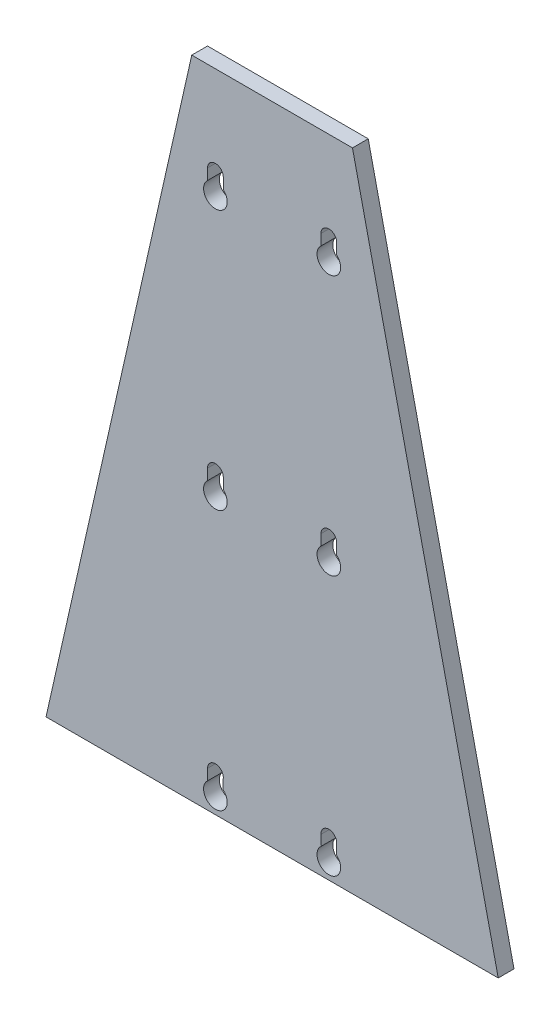
ISO-10303-21;
HEADER;
FILE_DESCRIPTION(('STEP AP214'),'2;1');
FILE_NAME('part.step','',(''),(''),'','','');
FILE_SCHEMA(('AUTOMOTIVE_DESIGN { 1 0 10303 214 1 1 1 1 }'));
ENDSEC;
DATA;
#1=APPLICATION_CONTEXT('core data for automotive mechanical design processes');
#2=APPLICATION_PROTOCOL_DEFINITION('international standard','automotive_design',2000,#1);
#3=PRODUCT_CONTEXT('',#1,'mechanical');
#4=PRODUCT('Part','Part','',(#3));
#5=PRODUCT_RELATED_PRODUCT_CATEGORY('part','',(#4));
#6=PRODUCT_DEFINITION_FORMATION('','',#4);
#7=PRODUCT_DEFINITION_CONTEXT('part definition',#1,'design');
#8=PRODUCT_DEFINITION('design','',#6,#7);
#9=PRODUCT_DEFINITION_SHAPE('','',#8);
#10=(LENGTH_UNIT() NAMED_UNIT(*) SI_UNIT(.MILLI.,.METRE.));
#11=(NAMED_UNIT(*) PLANE_ANGLE_UNIT() SI_UNIT($,.RADIAN.));
#12=(NAMED_UNIT(*) SI_UNIT($,.STERADIAN.) SOLID_ANGLE_UNIT());
#13=UNCERTAINTY_MEASURE_WITH_UNIT(LENGTH_MEASURE(1.E-05),#10,'distance_accuracy_value','');
#14=(GEOMETRIC_REPRESENTATION_CONTEXT(3) GLOBAL_UNCERTAINTY_ASSIGNED_CONTEXT((#13)) GLOBAL_UNIT_ASSIGNED_CONTEXT((#10,
#11,#12)) REPRESENTATION_CONTEXT('',''));
#15=CARTESIAN_POINT('',(0.,0.,0.));
#16=DIRECTION('',(0.,0.,1.));
#17=DIRECTION('',(1.,0.,0.));
#18=AXIS2_PLACEMENT_3D('',#15,#16,#17);
#19=CARTESIAN_POINT('',(31.,0.,10.));
#20=DIRECTION('',(1.,0.,0.));
#21=DIRECTION('',(0.,1.,0.));
#22=AXIS2_PLACEMENT_3D('',#19,#20,#21);
#23=PLANE('',#22);
#24=DIRECTION('',(0.,-1.,0.));
#25=VECTOR('',#24,1.);
#26=CARTESIAN_POINT('',(31.,0.,0.));
#27=LINE('',#26,#25);
#28=CARTESIAN_POINT('',(31.,-57.,0.));
#29=VERTEX_POINT('',#28);
#30=CARTESIAN_POINT('',(31.,-63.9098300562505,0.));
#31=VERTEX_POINT('',#30);
#32=EDGE_CURVE('E391',#29,#31,#27,.T.);
#33=ORIENTED_EDGE('',*,*,#32,.F.);
#34=DIRECTION('',(0.,0.,-1.));
#35=VECTOR('',#34,1.);
#36=CARTESIAN_POINT('',(31.,-57.,10.));
#37=LINE('',#36,#35);
#38=CARTESIAN_POINT('',(31.,-57.,10.));
#39=VERTEX_POINT('',#38);
#40=EDGE_CURVE('E11',#39,#29,#37,.T.);
#41=ORIENTED_EDGE('',*,*,#40,.F.);
#42=DIRECTION('',(0.,-1.,0.));
#43=VECTOR('',#42,1.);
#44=CARTESIAN_POINT('',(31.,0.,10.));
#45=LINE('',#44,#43);
#46=CARTESIAN_POINT('',(31.,-63.9098300562505,10.));
#47=VERTEX_POINT('',#46);
#48=EDGE_CURVE('E245',#39,#47,#45,.T.);
#49=ORIENTED_EDGE('',*,*,#48,.T.);
#50=DIRECTION('',(0.,0.,-1.));
#51=VECTOR('',#50,1.);
#52=CARTESIAN_POINT('',(31.,-63.9098300562505,10.));
#53=LINE('',#52,#51);
#54=EDGE_CURVE('E151',#47,#31,#53,.T.);
#55=ORIENTED_EDGE('',*,*,#54,.T.);
#56=EDGE_LOOP('',(#33,#41,#49,#55));
#57=FACE_BOUND('',#56,.T.);
#58=ADVANCED_FACE('F38',(#57),#23,.T.);
#59=CARTESIAN_POINT('',(36.,-57.,10.));
#60=DIRECTION('',(0.,0.,-1.));
#61=DIRECTION('',(-1.,0.,0.));
#62=AXIS2_PLACEMENT_3D('',#59,#60,#61);
#63=CYLINDRICAL_SURFACE('',#62,5.);
#64=CARTESIAN_POINT('',(36.,-57.,0.));
#65=DIRECTION('',(0.,0.,1.));
#66=DIRECTION('',(1.,0.,0.));
#67=AXIS2_PLACEMENT_3D('',#64,#65,#66);
#68=CIRCLE('',#67,5.);
#69=CARTESIAN_POINT('',(41.,-57.,0.));
#70=VERTEX_POINT('',#69);
#71=EDGE_CURVE('E250',#29,#70,#68,.F.);
#72=ORIENTED_EDGE('',*,*,#71,.T.);
#73=DIRECTION('',(0.,0.,-1.));
#74=VECTOR('',#73,1.);
#75=CARTESIAN_POINT('',(41.,-57.,10.));
#76=LINE('',#75,#74);
#77=CARTESIAN_POINT('',(41.,-57.,10.));
#78=VERTEX_POINT('',#77);
#79=EDGE_CURVE('E48',#78,#70,#76,.T.);
#80=ORIENTED_EDGE('',*,*,#79,.F.);
#81=CARTESIAN_POINT('',(36.,-57.,10.));
#82=DIRECTION('',(0.,0.,1.));
#83=DIRECTION('',(1.,0.,0.));
#84=AXIS2_PLACEMENT_3D('',#81,#82,#83);
#85=CIRCLE('',#84,5.);
#86=EDGE_CURVE('E241',#39,#78,#85,.F.);
#87=ORIENTED_EDGE('',*,*,#86,.F.);
#88=ORIENTED_EDGE('',*,*,#40,.T.);
#89=EDGE_LOOP('',(#72,#80,#87,#88));
#90=FACE_BOUND('',#89,.T.);
#91=ADVANCED_FACE('F248',(#90),#63,.F.);
#92=CARTESIAN_POINT('',(41.,0.,10.));
#93=DIRECTION('',(1.,0.,0.));
#94=DIRECTION('',(0.,0.,-1.));
#95=AXIS2_PLACEMENT_3D('',#92,#93,#94);
#96=PLANE('',#95);
#97=DIRECTION('',(0.,-1.,0.));
#98=VECTOR('',#97,1.);
#99=CARTESIAN_POINT('',(41.,0.,0.));
#100=LINE('',#99,#98);
#101=CARTESIAN_POINT('',(41.,-63.9098300562505,0.));
#102=VERTEX_POINT('',#101);
#103=EDGE_CURVE('E394',#70,#102,#100,.T.);
#104=ORIENTED_EDGE('',*,*,#103,.T.);
#105=DIRECTION('',(0.,0.,-1.));
#106=VECTOR('',#105,1.);
#107=CARTESIAN_POINT('',(41.,-63.9098300562505,10.));
#108=LINE('',#107,#106);
#109=CARTESIAN_POINT('',(41.,-63.9098300562505,10.));
#110=VERTEX_POINT('',#109);
#111=EDGE_CURVE('E240',#110,#102,#108,.T.);
#112=ORIENTED_EDGE('',*,*,#111,.F.);
#113=DIRECTION('',(0.,-1.,0.));
#114=VECTOR('',#113,1.);
#115=CARTESIAN_POINT('',(41.,0.,10.));
#116=LINE('',#115,#114);
#117=EDGE_CURVE('E234',#78,#110,#116,.T.);
#118=ORIENTED_EDGE('',*,*,#117,.F.);
#119=ORIENTED_EDGE('',*,*,#79,.T.);
#120=EDGE_LOOP('',(#104,#112,#118,#119));
#121=FACE_BOUND('',#120,.T.);
#122=ADVANCED_FACE('F237',(#121),#96,.F.);
#123=CARTESIAN_POINT('',(31.0000000000001,0.,10.));
#124=DIRECTION('',(1.,0.,0.));
#125=DIRECTION('',(0.,0.,-1.));
#126=AXIS2_PLACEMENT_3D('',#123,#124,#125);
#127=PLANE('',#126);
#128=DIRECTION('',(0.,-1.,0.));
#129=VECTOR('',#128,1.);
#130=CARTESIAN_POINT('',(31.0000000000001,0.,0.));
#131=LINE('',#130,#129);
#132=CARTESIAN_POINT('',(31.0000000000001,-222.,0.));
#133=VERTEX_POINT('',#132);
#134=CARTESIAN_POINT('',(31.0000000000001,-228.909830056251,0.));
#135=VERTEX_POINT('',#134);
#136=EDGE_CURVE('E379',#133,#135,#131,.T.);
#137=ORIENTED_EDGE('',*,*,#136,.F.);
#138=DIRECTION('',(0.,0.,-1.));
#139=VECTOR('',#138,1.);
#140=CARTESIAN_POINT('',(31.0000000000001,-222.,10.));
#141=LINE('',#140,#139);
#142=CARTESIAN_POINT('',(31.0000000000001,-222.,10.));
#143=VERTEX_POINT('',#142);
#144=EDGE_CURVE('E264',#143,#133,#141,.T.);
#145=ORIENTED_EDGE('',*,*,#144,.F.);
#146=DIRECTION('',(0.,-1.,0.));
#147=VECTOR('',#146,1.);
#148=CARTESIAN_POINT('',(31.0000000000001,0.,10.));
#149=LINE('',#148,#147);
#150=CARTESIAN_POINT('',(31.0000000000001,-228.909830056251,10.));
#151=VERTEX_POINT('',#150);
#152=EDGE_CURVE('E448',#143,#151,#149,.T.);
#153=ORIENTED_EDGE('',*,*,#152,.T.);
#154=DIRECTION('',(0.,0.,-1.));
#155=VECTOR('',#154,1.);
#156=CARTESIAN_POINT('',(31.0000000000001,-228.909830056251,10.));
#157=LINE('',#156,#155);
#158=EDGE_CURVE('E255',#151,#135,#157,.T.);
#159=ORIENTED_EDGE('',*,*,#158,.T.);
#160=EDGE_LOOP('',(#137,#145,#153,#159));
#161=FACE_BOUND('',#160,.T.);
#162=ADVANCED_FACE('F490',(#161),#127,.T.);
#163=CARTESIAN_POINT('',(36.,-222.,10.));
#164=DIRECTION('',(0.,0.,-1.));
#165=DIRECTION('',(-1.,0.,0.));
#166=AXIS2_PLACEMENT_3D('',#163,#164,#165);
#167=CYLINDRICAL_SURFACE('',#166,5.);
#168=CARTESIAN_POINT('',(36.,-222.,0.));
#169=DIRECTION('',(0.,0.,1.));
#170=DIRECTION('',(1.,0.,0.));
#171=AXIS2_PLACEMENT_3D('',#168,#169,#170);
#172=CIRCLE('',#171,5.);
#173=CARTESIAN_POINT('',(41.0000000000001,-222.,0.));
#174=VERTEX_POINT('',#173);
#175=EDGE_CURVE('E382',#133,#174,#172,.F.);
#176=ORIENTED_EDGE('',*,*,#175,.T.);
#177=DIRECTION('',(0.,0.,-1.));
#178=VECTOR('',#177,1.);
#179=CARTESIAN_POINT('',(41.0000000000001,-222.,10.));
#180=LINE('',#179,#178);
#181=CARTESIAN_POINT('',(41.0000000000001,-222.,10.));
#182=VERTEX_POINT('',#181);
#183=EDGE_CURVE('E261',#182,#174,#180,.T.);
#184=ORIENTED_EDGE('',*,*,#183,.F.);
#185=CARTESIAN_POINT('',(36.,-222.,10.));
#186=DIRECTION('',(0.,0.,1.));
#187=DIRECTION('',(1.,0.,0.));
#188=AXIS2_PLACEMENT_3D('',#185,#186,#187);
#189=CIRCLE('',#188,5.);
#190=EDGE_CURVE('E451',#143,#182,#189,.F.);
#191=ORIENTED_EDGE('',*,*,#190,.F.);
#192=ORIENTED_EDGE('',*,*,#144,.T.);
#193=EDGE_LOOP('',(#176,#184,#191,#192));
#194=FACE_BOUND('',#193,.T.);
#195=ADVANCED_FACE('F486',(#194),#167,.F.);
#196=CARTESIAN_POINT('',(41.0000000000001,0.,10.));
#197=DIRECTION('',(1.,0.,0.));
#198=DIRECTION('',(0.,0.,-1.));
#199=AXIS2_PLACEMENT_3D('',#196,#197,#198);
#200=PLANE('',#199);
#201=DIRECTION('',(0.,-1.,0.));
#202=VECTOR('',#201,1.);
#203=CARTESIAN_POINT('',(41.0000000000001,0.,0.));
#204=LINE('',#203,#202);
#205=CARTESIAN_POINT('',(41.0000000000001,-228.909830056251,0.));
#206=VERTEX_POINT('',#205);
#207=EDGE_CURVE('E385',#174,#206,#204,.T.);
#208=ORIENTED_EDGE('',*,*,#207,.T.);
#209=DIRECTION('',(0.,0.,-1.));
#210=VECTOR('',#209,1.);
#211=CARTESIAN_POINT('',(41.0000000000001,-228.909830056251,10.));
#212=LINE('',#211,#210);
#213=CARTESIAN_POINT('',(41.0000000000001,-228.909830056251,10.));
#214=VERTEX_POINT('',#213);
#215=EDGE_CURVE('E257',#214,#206,#212,.T.);
#216=ORIENTED_EDGE('',*,*,#215,.F.);
#217=DIRECTION('',(0.,-1.,0.));
#218=VECTOR('',#217,1.);
#219=CARTESIAN_POINT('',(41.0000000000001,0.,10.));
#220=LINE('',#219,#218);
#221=EDGE_CURVE('E454',#182,#214,#220,.T.);
#222=ORIENTED_EDGE('',*,*,#221,.F.);
#223=ORIENTED_EDGE('',*,*,#183,.T.);
#224=EDGE_LOOP('',(#208,#216,#222,#223));
#225=FACE_BOUND('',#224,.T.);
#226=ADVANCED_FACE('F482',(#225),#200,.F.);
#227=CARTESIAN_POINT('',(41.0000000000005,0.,10.));
#228=DIRECTION('',(1.,0.,0.));
#229=DIRECTION('',(0.,1.,0.));
#230=AXIS2_PLACEMENT_3D('',#227,#228,#229);
#231=PLANE('',#230);
#232=DIRECTION('',(0.,-1.,0.));
#233=VECTOR('',#232,1.);
#234=CARTESIAN_POINT('',(41.0000000000005,0.,0.));
#235=LINE('',#234,#233);
#236=CARTESIAN_POINT('',(41.0000000000001,-387.,0.));
#237=VERTEX_POINT('',#236);
#238=CARTESIAN_POINT('',(41.0000000000001,-393.909830056251,0.));
#239=VERTEX_POINT('',#238);
#240=EDGE_CURVE('E368',#237,#239,#235,.T.);
#241=ORIENTED_EDGE('',*,*,#240,.T.);
#242=DIRECTION('',(0.,0.,-1.));
#243=VECTOR('',#242,1.);
#244=CARTESIAN_POINT('',(41.0000000000001,-393.909830056251,10.));
#245=LINE('',#244,#243);
#246=CARTESIAN_POINT('',(41.0000000000001,-393.909830056251,10.));
#247=VERTEX_POINT('',#246);
#248=EDGE_CURVE('E258',#247,#239,#245,.T.);
#249=ORIENTED_EDGE('',*,*,#248,.F.);
#250=DIRECTION('',(0.,-1.,0.));
#251=VECTOR('',#250,1.);
#252=CARTESIAN_POINT('',(41.0000000000005,0.,10.));
#253=LINE('',#252,#251);
#254=CARTESIAN_POINT('',(41.0000000000001,-387.,10.));
#255=VERTEX_POINT('',#254);
#256=EDGE_CURVE('E438',#255,#247,#253,.T.);
#257=ORIENTED_EDGE('',*,*,#256,.F.);
#258=DIRECTION('',(0.,0.,-1.));
#259=VECTOR('',#258,1.);
#260=CARTESIAN_POINT('',(41.0000000000001,-387.,10.));
#261=LINE('',#260,#259);
#262=EDGE_CURVE('E266',#255,#237,#261,.T.);
#263=ORIENTED_EDGE('',*,*,#262,.T.);
#264=EDGE_LOOP('',(#241,#249,#257,#263));
#265=FACE_BOUND('',#264,.T.);
#266=ADVANCED_FACE('F485',(#265),#231,.F.);
#267=CARTESIAN_POINT('',(36.0000000000001,-399.5,10.));
#268=DIRECTION('',(0.,0.,-1.));
#269=DIRECTION('',(-1.,0.,0.));
#270=AXIS2_PLACEMENT_3D('',#267,#268,#269);
#271=CYLINDRICAL_SURFACE('',#270,7.50000000000002);
#272=CARTESIAN_POINT('',(36.0000000000001,-399.5,0.));
#273=DIRECTION('',(0.,0.,1.));
#274=DIRECTION('',(1.,0.,0.));
#275=AXIS2_PLACEMENT_3D('',#272,#273,#274);
#276=CIRCLE('',#275,7.50000000000002);
#277=CARTESIAN_POINT('',(31.1897541478711,-393.74573768046,0.));
#278=VERTEX_POINT('',#277);
#279=EDGE_CURVE('E371',#239,#278,#276,.F.);
#280=ORIENTED_EDGE('',*,*,#279,.T.);
#281=DIRECTION('',(0.,0.,-1.));
#282=VECTOR('',#281,1.);
#283=CARTESIAN_POINT('',(31.1897541478711,-393.74573768046,10.));
#284=LINE('',#283,#282);
#285=CARTESIAN_POINT('',(31.1897541478711,-393.74573768046,10.));
#286=VERTEX_POINT('',#285);
#287=EDGE_CURVE('E272',#286,#278,#284,.T.);
#288=ORIENTED_EDGE('',*,*,#287,.F.);
#289=CARTESIAN_POINT('',(36.0000000000001,-399.5,10.));
#290=DIRECTION('',(0.,0.,1.));
#291=DIRECTION('',(1.,0.,0.));
#292=AXIS2_PLACEMENT_3D('',#289,#290,#291);
#293=CIRCLE('',#292,7.50000000000002);
#294=EDGE_CURVE('E441',#247,#286,#293,.F.);
#295=ORIENTED_EDGE('',*,*,#294,.F.);
#296=ORIENTED_EDGE('',*,*,#248,.T.);
#297=EDGE_LOOP('',(#280,#288,#295,#296));
#298=FACE_BOUND('',#297,.T.);
#299=ADVANCED_FACE('F503',(#298),#271,.F.);
#300=CARTESIAN_POINT('',(20.0979852071029,0.565346035904268,10.));
#301=DIRECTION('',(0.999604600584097,0.0281183657261408,0.));
#302=DIRECTION('',(-0.0281183657261408,0.999604600584097,0.));
#303=AXIS2_PLACEMENT_3D('',#300,#301,#302);
#304=PLANE('',#303);
#305=DIRECTION('',(0.0281183657261408,-0.999604600584097,0.));
#306=VECTOR('',#305,1.);
#307=CARTESIAN_POINT('',(20.0979852071029,0.565346035904268,0.));
#308=LINE('',#307,#306);
#309=CARTESIAN_POINT('',(31.0079064249112,-387.281072477408,0.));
#310=VERTEX_POINT('',#309);
#311=EDGE_CURVE('E374',#310,#278,#308,.T.);
#312=ORIENTED_EDGE('',*,*,#311,.F.);
#313=DIRECTION('',(0.,0.,-1.));
#314=VECTOR('',#313,1.);
#315=CARTESIAN_POINT('',(31.0079064249112,-387.281072477408,10.));
#316=LINE('',#315,#314);
#317=CARTESIAN_POINT('',(31.0079064249112,-387.281072477408,10.));
#318=VERTEX_POINT('',#317);
#319=EDGE_CURVE('E269',#318,#310,#316,.T.);
#320=ORIENTED_EDGE('',*,*,#319,.F.);
#321=DIRECTION('',(0.0281183657261408,-0.999604600584097,0.));
#322=VECTOR('',#321,1.);
#323=CARTESIAN_POINT('',(20.0979852071029,0.565346035904268,10.));
#324=LINE('',#323,#322);
#325=EDGE_CURVE('E443',#318,#286,#324,.T.);
#326=ORIENTED_EDGE('',*,*,#325,.T.);
#327=ORIENTED_EDGE('',*,*,#287,.T.);
#328=EDGE_LOOP('',(#312,#320,#326,#327));
#329=FACE_BOUND('',#328,.T.);
#330=ADVANCED_FACE('F499',(#329),#304,.T.);
#331=CARTESIAN_POINT('',(-48.5298425614718,10.9488059437467,10.));
#332=DIRECTION('',(-0.97548220917709,0.220078303289953,0.));
#333=DIRECTION('',(-0.220078303289953,-0.97548220917709,0.));
#334=AXIS2_PLACEMENT_3D('',#331,#332,#333);
#335=PLANE('',#334);
#336=DIRECTION('',(0.220078303289953,0.97548220917709,0.));
#337=VECTOR('',#336,1.);
#338=CARTESIAN_POINT('',(-48.5298425614718,10.9488059437467,0.));
#339=LINE('',#338,#337);
#340=CARTESIAN_POINT('',(-143.5,-410.,0.));
#341=VERTEX_POINT('',#340);
#342=CARTESIAN_POINT('',(-51.,0.,0.));
#343=VERTEX_POINT('',#342);
#344=EDGE_CURVE('E356',#341,#343,#339,.T.);
#345=ORIENTED_EDGE('',*,*,#344,.F.);
#346=DIRECTION('',(0.,0.,-1.));
#347=VECTOR('',#346,1.);
#348=CARTESIAN_POINT('',(-143.5,-410.,10.));
#349=LINE('',#348,#347);
#350=CARTESIAN_POINT('',(-143.5,-410.,10.));
#351=VERTEX_POINT('',#350);
#352=EDGE_CURVE('E270',#351,#341,#349,.T.);
#353=ORIENTED_EDGE('',*,*,#352,.F.);
#354=DIRECTION('',(0.220078303289953,0.97548220917709,0.));
#355=VECTOR('',#354,1.);
#356=CARTESIAN_POINT('',(-48.5298425614718,10.9488059437467,10.));
#357=LINE('',#356,#355);
#358=CARTESIAN_POINT('',(-51.,0.,10.));
#359=VERTEX_POINT('',#358);
#360=EDGE_CURVE('E427',#351,#359,#357,.T.);
#361=ORIENTED_EDGE('',*,*,#360,.T.);
#362=DIRECTION('',(0.,0.,-1.));
#363=VECTOR('',#362,1.);
#364=CARTESIAN_POINT('',(-51.,0.,10.));
#365=LINE('',#364,#363);
#366=EDGE_CURVE('E276',#359,#343,#365,.T.);
#367=ORIENTED_EDGE('',*,*,#366,.T.);
#368=EDGE_LOOP('',(#345,#353,#361,#367));
#369=FACE_BOUND('',#368,.T.);
#370=ADVANCED_FACE('F502',(#369),#335,.T.);
#371=CARTESIAN_POINT('',(0.,-410.,10.));
#372=DIRECTION('',(0.,1.,0.));
#373=DIRECTION('',(-1.,0.,0.));
#374=AXIS2_PLACEMENT_3D('',#371,#372,#373);
#375=PLANE('',#374);
#376=DIRECTION('',(1.,0.,0.));
#377=VECTOR('',#376,1.);
#378=CARTESIAN_POINT('',(0.,-410.,0.));
#379=LINE('',#378,#377);
#380=CARTESIAN_POINT('',(143.5,-410.,0.));
#381=VERTEX_POINT('',#380);
#382=EDGE_CURVE('E359',#341,#381,#379,.T.);
#383=ORIENTED_EDGE('',*,*,#382,.T.);
#384=DIRECTION('',(0.,0.,-1.));
#385=VECTOR('',#384,1.);
#386=CARTESIAN_POINT('',(143.5,-410.,10.));
#387=LINE('',#386,#385);
#388=CARTESIAN_POINT('',(143.5,-410.,10.));
#389=VERTEX_POINT('',#388);
#390=EDGE_CURVE('E281',#389,#381,#387,.T.);
#391=ORIENTED_EDGE('',*,*,#390,.F.);
#392=DIRECTION('',(1.,0.,0.));
#393=VECTOR('',#392,1.);
#394=CARTESIAN_POINT('',(0.,-410.,10.));
#395=LINE('',#394,#393);
#396=EDGE_CURVE('E430',#351,#389,#395,.T.);
#397=ORIENTED_EDGE('',*,*,#396,.F.);
#398=ORIENTED_EDGE('',*,*,#352,.T.);
#399=EDGE_LOOP('',(#383,#391,#397,#398));
#400=FACE_BOUND('',#399,.T.);
#401=ADVANCED_FACE('F519',(#400),#375,.F.);
#402=CARTESIAN_POINT('',(48.5298425614718,10.9488059437467,10.));
#403=DIRECTION('',(-0.97548220917709,-0.220078303289953,0.));
#404=DIRECTION('',(0.220078303289953,-0.97548220917709,0.));
#405=AXIS2_PLACEMENT_3D('',#402,#403,#404);
#406=PLANE('',#405);
#407=DIRECTION('',(-0.220078303289953,0.97548220917709,0.));
#408=VECTOR('',#407,1.);
#409=CARTESIAN_POINT('',(48.5298425614718,10.9488059437467,0.));
#410=LINE('',#409,#408);
#411=CARTESIAN_POINT('',(51.,0.,0.));
#412=VERTEX_POINT('',#411);
#413=EDGE_CURVE('E362',#381,#412,#410,.T.);
#414=ORIENTED_EDGE('',*,*,#413,.T.);
#415=DIRECTION('',(0.,0.,-1.));
#416=VECTOR('',#415,1.);
#417=CARTESIAN_POINT('',(51.,0.,10.));
#418=LINE('',#417,#416);
#419=CARTESIAN_POINT('',(51.,0.,10.));
#420=VERTEX_POINT('',#419);
#421=EDGE_CURVE('E278',#420,#412,#418,.T.);
#422=ORIENTED_EDGE('',*,*,#421,.F.);
#423=DIRECTION('',(-0.220078303289953,0.97548220917709,0.));
#424=VECTOR('',#423,1.);
#425=CARTESIAN_POINT('',(48.5298425614718,10.9488059437467,10.));
#426=LINE('',#425,#424);
#427=EDGE_CURVE('E433',#389,#420,#426,.T.);
#428=ORIENTED_EDGE('',*,*,#427,.F.);
#429=ORIENTED_EDGE('',*,*,#390,.T.);
#430=EDGE_LOOP('',(#414,#422,#428,#429));
#431=FACE_BOUND('',#430,.T.);
#432=ADVANCED_FACE('F515',(#431),#406,.F.);
#433=CARTESIAN_POINT('',(-36.,-234.5,10.));
#434=DIRECTION('',(0.,0.,-1.));
#435=DIRECTION('',(-1.,0.,0.));
#436=AXIS2_PLACEMENT_3D('',#433,#434,#435);
#437=CYLINDRICAL_SURFACE('',#436,7.5);
#438=CARTESIAN_POINT('',(-36.,-234.5,0.));
#439=DIRECTION('',(0.,0.,1.));
#440=DIRECTION('',(1.,0.,0.));
#441=AXIS2_PLACEMENT_3D('',#438,#439,#440);
#442=CIRCLE('',#441,7.5);
#443=CARTESIAN_POINT('',(-41.,-228.909830056251,0.));
#444=VERTEX_POINT('',#443);
#445=CARTESIAN_POINT('',(-31.,-228.909830056251,0.));
#446=VERTEX_POINT('',#445);
#447=EDGE_CURVE('E344',#444,#446,#442,.T.);
#448=ORIENTED_EDGE('',*,*,#447,.F.);
#449=DIRECTION('',(0.,0.,-1.));
#450=VECTOR('',#449,1.);
#451=CARTESIAN_POINT('',(-41.,-228.909830056251,10.));
#452=LINE('',#451,#450);
#453=CARTESIAN_POINT('',(-41.,-228.909830056251,10.));
#454=VERTEX_POINT('',#453);
#455=EDGE_CURVE('E279',#454,#444,#452,.T.);
#456=ORIENTED_EDGE('',*,*,#455,.F.);
#457=CARTESIAN_POINT('',(-36.,-234.5,10.));
#458=DIRECTION('',(0.,0.,1.));
#459=DIRECTION('',(1.,0.,0.));
#460=AXIS2_PLACEMENT_3D('',#457,#458,#459);
#461=CIRCLE('',#460,7.5);
#462=CARTESIAN_POINT('',(-31.,-228.909830056251,10.));
#463=VERTEX_POINT('',#462);
#464=EDGE_CURVE('E416',#454,#463,#461,.T.);
#465=ORIENTED_EDGE('',*,*,#464,.T.);
#466=DIRECTION('',(0.,0.,-1.));
#467=VECTOR('',#466,1.);
#468=CARTESIAN_POINT('',(-31.,-228.909830056251,10.));
#469=LINE('',#468,#467);
#470=EDGE_CURVE('E285',#463,#446,#469,.T.);
#471=ORIENTED_EDGE('',*,*,#470,.T.);
#472=EDGE_LOOP('',(#448,#456,#465,#471));
#473=FACE_BOUND('',#472,.T.);
#474=ADVANCED_FACE('F518',(#473),#437,.F.);
#475=CARTESIAN_POINT('',(-41.,0.,10.));
#476=DIRECTION('',(1.,0.,0.));
#477=DIRECTION('',(0.,0.,-1.));
#478=AXIS2_PLACEMENT_3D('',#475,#476,#477);
#479=PLANE('',#478);
#480=DIRECTION('',(0.,-1.,0.));
#481=VECTOR('',#480,1.);
#482=CARTESIAN_POINT('',(-41.,0.,0.));
#483=LINE('',#482,#481);
#484=CARTESIAN_POINT('',(-41.,-222.,0.));
#485=VERTEX_POINT('',#484);
#486=EDGE_CURVE('E347',#485,#444,#483,.T.);
#487=ORIENTED_EDGE('',*,*,#486,.F.);
#488=DIRECTION('',(0.,0.,-1.));
#489=VECTOR('',#488,1.);
#490=CARTESIAN_POINT('',(-41.,-222.,10.));
#491=LINE('',#490,#489);
#492=CARTESIAN_POINT('',(-41.,-222.,10.));
#493=VERTEX_POINT('',#492);
#494=EDGE_CURVE('E290',#493,#485,#491,.T.);
#495=ORIENTED_EDGE('',*,*,#494,.F.);
#496=DIRECTION('',(0.,-1.,0.));
#497=VECTOR('',#496,1.);
#498=CARTESIAN_POINT('',(-41.,0.,10.));
#499=LINE('',#498,#497);
#500=EDGE_CURVE('E419',#493,#454,#499,.T.);
#501=ORIENTED_EDGE('',*,*,#500,.T.);
#502=ORIENTED_EDGE('',*,*,#455,.T.);
#503=EDGE_LOOP('',(#487,#495,#501,#502));
#504=FACE_BOUND('',#503,.T.);
#505=ADVANCED_FACE('F535',(#504),#479,.T.);
#506=CARTESIAN_POINT('',(-36.,-222.,10.));
#507=DIRECTION('',(0.,0.,-1.));
#508=DIRECTION('',(-1.,0.,0.));
#509=AXIS2_PLACEMENT_3D('',#506,#507,#508);
#510=CYLINDRICAL_SURFACE('',#509,5.);
#511=CARTESIAN_POINT('',(-36.,-222.,0.));
#512=DIRECTION('',(0.,0.,1.));
#513=DIRECTION('',(1.,0.,0.));
#514=AXIS2_PLACEMENT_3D('',#511,#512,#513);
#515=CIRCLE('',#514,5.);
#516=CARTESIAN_POINT('',(-31.,-222.,0.));
#517=VERTEX_POINT('',#516);
#518=EDGE_CURVE('E350',#517,#485,#515,.T.);
#519=ORIENTED_EDGE('',*,*,#518,.F.);
#520=DIRECTION('',(0.,0.,-1.));
#521=VECTOR('',#520,1.);
#522=CARTESIAN_POINT('',(-31.,-222.,10.));
#523=LINE('',#522,#521);
#524=CARTESIAN_POINT('',(-31.,-222.,10.));
#525=VERTEX_POINT('',#524);
#526=EDGE_CURVE('E287',#525,#517,#523,.T.);
#527=ORIENTED_EDGE('',*,*,#526,.F.);
#528=CARTESIAN_POINT('',(-36.,-222.,10.));
#529=DIRECTION('',(0.,0.,1.));
#530=DIRECTION('',(1.,0.,0.));
#531=AXIS2_PLACEMENT_3D('',#528,#529,#530);
#532=CIRCLE('',#531,5.);
#533=EDGE_CURVE('E422',#525,#493,#532,.T.);
#534=ORIENTED_EDGE('',*,*,#533,.T.);
#535=ORIENTED_EDGE('',*,*,#494,.T.);
#536=EDGE_LOOP('',(#519,#527,#534,#535));
#537=FACE_BOUND('',#536,.T.);
#538=ADVANCED_FACE('F531',(#537),#510,.F.);
#539=CARTESIAN_POINT('',(-36.,-69.5,10.));
#540=DIRECTION('',(0.,0.,-1.));
#541=DIRECTION('',(-1.,0.,0.));
#542=AXIS2_PLACEMENT_3D('',#539,#540,#541);
#543=CYLINDRICAL_SURFACE('',#542,7.5);
#544=CARTESIAN_POINT('',(-36.,-69.5,0.));
#545=DIRECTION('',(0.,0.,1.));
#546=DIRECTION('',(1.,0.,0.));
#547=AXIS2_PLACEMENT_3D('',#544,#545,#546);
#548=CIRCLE('',#547,7.5);
#549=CARTESIAN_POINT('',(-41.,-63.9098300562505,0.));
#550=VERTEX_POINT('',#549);
#551=CARTESIAN_POINT('',(-31.,-63.9098300562505,0.));
#552=VERTEX_POINT('',#551);
#553=EDGE_CURVE('E332',#550,#552,#548,.T.);
#554=ORIENTED_EDGE('',*,*,#553,.F.);
#555=DIRECTION('',(0.,0.,-1.));
#556=VECTOR('',#555,1.);
#557=CARTESIAN_POINT('',(-41.,-63.9098300562505,10.));
#558=LINE('',#557,#556);
#559=CARTESIAN_POINT('',(-41.,-63.9098300562505,10.));
#560=VERTEX_POINT('',#559);
#561=EDGE_CURVE('E288',#560,#550,#558,.T.);
#562=ORIENTED_EDGE('',*,*,#561,.F.);
#563=CARTESIAN_POINT('',(-36.,-69.5,10.));
#564=DIRECTION('',(0.,0.,1.));
#565=DIRECTION('',(1.,0.,0.));
#566=AXIS2_PLACEMENT_3D('',#563,#564,#565);
#567=CIRCLE('',#566,7.5);
#568=CARTESIAN_POINT('',(-31.,-63.9098300562505,10.));
#569=VERTEX_POINT('',#568);
#570=EDGE_CURVE('E405',#560,#569,#567,.T.);
#571=ORIENTED_EDGE('',*,*,#570,.T.);
#572=DIRECTION('',(0.,0.,-1.));
#573=VECTOR('',#572,1.);
#574=CARTESIAN_POINT('',(-31.,-63.9098300562505,10.));
#575=LINE('',#574,#573);
#576=EDGE_CURVE('E293',#569,#552,#575,.T.);
#577=ORIENTED_EDGE('',*,*,#576,.T.);
#578=EDGE_LOOP('',(#554,#562,#571,#577));
#579=FACE_BOUND('',#578,.T.);
#580=ADVANCED_FACE('F534',(#579),#543,.F.);
#581=CARTESIAN_POINT('',(-41.,0.,10.));
#582=DIRECTION('',(1.,0.,0.));
#583=DIRECTION('',(0.,0.,-1.));
#584=AXIS2_PLACEMENT_3D('',#581,#582,#583);
#585=PLANE('',#584);
#586=DIRECTION('',(0.,-1.,0.));
#587=VECTOR('',#586,1.);
#588=CARTESIAN_POINT('',(-41.,0.,0.));
#589=LINE('',#588,#587);
#590=CARTESIAN_POINT('',(-41.,-57.,0.));
#591=VERTEX_POINT('',#590);
#592=EDGE_CURVE('E335',#591,#550,#589,.T.);
#593=ORIENTED_EDGE('',*,*,#592,.F.);
#594=DIRECTION('',(0.,0.,-1.));
#595=VECTOR('',#594,1.);
#596=CARTESIAN_POINT('',(-41.,-57.,10.));
#597=LINE('',#596,#595);
#598=CARTESIAN_POINT('',(-41.,-57.,10.));
#599=VERTEX_POINT('',#598);
#600=EDGE_CURVE('E297',#599,#591,#597,.T.);
#601=ORIENTED_EDGE('',*,*,#600,.F.);
#602=DIRECTION('',(0.,-1.,0.));
#603=VECTOR('',#602,1.);
#604=CARTESIAN_POINT('',(-41.,0.,10.));
#605=LINE('',#604,#603);
#606=EDGE_CURVE('E408',#599,#560,#605,.T.);
#607=ORIENTED_EDGE('',*,*,#606,.T.);
#608=ORIENTED_EDGE('',*,*,#561,.T.);
#609=EDGE_LOOP('',(#593,#601,#607,#608));
#610=FACE_BOUND('',#609,.T.);
#611=ADVANCED_FACE('F550',(#610),#585,.T.);
#612=CARTESIAN_POINT('',(-36.,-57.,10.));
#613=DIRECTION('',(0.,0.,-1.));
#614=DIRECTION('',(-1.,0.,0.));
#615=AXIS2_PLACEMENT_3D('',#612,#613,#614);
#616=CYLINDRICAL_SURFACE('',#615,5.);
#617=CARTESIAN_POINT('',(-36.,-57.,0.));
#618=DIRECTION('',(0.,0.,1.));
#619=DIRECTION('',(1.,0.,0.));
#620=AXIS2_PLACEMENT_3D('',#617,#618,#619);
#621=CIRCLE('',#620,5.);
#622=CARTESIAN_POINT('',(-31.,-57.,0.));
#623=VERTEX_POINT('',#622);
#624=EDGE_CURVE('E338',#623,#591,#621,.T.);
#625=ORIENTED_EDGE('',*,*,#624,.F.);
#626=DIRECTION('',(0.,0.,-1.));
#627=VECTOR('',#626,1.);
#628=CARTESIAN_POINT('',(-31.,-57.,10.));
#629=LINE('',#628,#627);
#630=CARTESIAN_POINT('',(-31.,-57.,10.));
#631=VERTEX_POINT('',#630);
#632=EDGE_CURVE('E295',#631,#623,#629,.T.);
#633=ORIENTED_EDGE('',*,*,#632,.F.);
#634=CARTESIAN_POINT('',(-36.,-57.,10.));
#635=DIRECTION('',(0.,0.,1.));
#636=DIRECTION('',(1.,0.,0.));
#637=AXIS2_PLACEMENT_3D('',#634,#635,#636);
#638=CIRCLE('',#637,5.);
#639=EDGE_CURVE('E411',#631,#599,#638,.T.);
#640=ORIENTED_EDGE('',*,*,#639,.T.);
#641=ORIENTED_EDGE('',*,*,#600,.T.);
#642=EDGE_LOOP('',(#625,#633,#640,#641));
#643=FACE_BOUND('',#642,.T.);
#644=ADVANCED_FACE('F547',(#643),#616,.F.);
#645=CARTESIAN_POINT('',(-36.,-399.5,10.));
#646=DIRECTION('',(0.,0.,-1.));
#647=DIRECTION('',(-1.,0.,0.));
#648=AXIS2_PLACEMENT_3D('',#645,#646,#647);
#649=CYLINDRICAL_SURFACE('',#648,7.50000000000002);
#650=CARTESIAN_POINT('',(-36.,-399.5,0.));
#651=DIRECTION('',(0.,0.,1.));
#652=DIRECTION('',(1.,0.,0.));
#653=AXIS2_PLACEMENT_3D('',#650,#651,#652);
#654=CIRCLE('',#653,7.50000000000002);
#655=CARTESIAN_POINT('',(-41.,-393.909830056251,0.));
#656=VERTEX_POINT('',#655);
#657=CARTESIAN_POINT('',(-31.189754147871,-393.74573768046,0.));
#658=VERTEX_POINT('',#657);
#659=EDGE_CURVE('E317',#656,#658,#654,.T.);
#660=ORIENTED_EDGE('',*,*,#659,.F.);
#661=DIRECTION('',(0.,0.,-1.));
#662=VECTOR('',#661,1.);
#663=CARTESIAN_POINT('',(-41.,-393.909830056251,10.));
#664=LINE('',#663,#662);
#665=CARTESIAN_POINT('',(-41.,-393.909830056251,10.));
#666=VERTEX_POINT('',#665);
#667=EDGE_CURVE('E42',#666,#656,#664,.T.);
#668=ORIENTED_EDGE('',*,*,#667,.F.);
#669=CARTESIAN_POINT('',(-36.,-399.5,10.));
#670=DIRECTION('',(0.,0.,1.));
#671=DIRECTION('',(1.,0.,0.));
#672=AXIS2_PLACEMENT_3D('',#669,#670,#671);
#673=CIRCLE('',#672,7.50000000000002);
#674=CARTESIAN_POINT('',(-31.189754147871,-393.74573768046,10.));
#675=VERTEX_POINT('',#674);
#676=EDGE_CURVE('E396',#666,#675,#673,.T.);
#677=ORIENTED_EDGE('',*,*,#676,.T.);
#678=DIRECTION('',(0.,0.,-1.));
#679=VECTOR('',#678,1.);
#680=CARTESIAN_POINT('',(-31.189754147871,-393.74573768046,10.));
#681=LINE('',#680,#679);
#682=EDGE_CURVE('E300',#675,#658,#681,.T.);
#683=ORIENTED_EDGE('',*,*,#682,.T.);
#684=EDGE_LOOP('',(#660,#668,#677,#683));
#685=FACE_BOUND('',#684,.T.);
#686=ADVANCED_FACE('F40',(#685),#649,.F.);
#687=CARTESIAN_POINT('',(-41.0000000000004,0.,10.));
#688=DIRECTION('',(1.,0.,0.));
#689=DIRECTION('',(0.,1.,0.));
#690=AXIS2_PLACEMENT_3D('',#687,#688,#689);
#691=PLANE('',#690);
#692=DIRECTION('',(0.,-1.,0.));
#693=VECTOR('',#692,1.);
#694=CARTESIAN_POINT('',(-41.0000000000004,0.,0.));
#695=LINE('',#694,#693);
#696=CARTESIAN_POINT('',(-41.,-387.,0.));
#697=VERTEX_POINT('',#696);
#698=EDGE_CURVE('E312',#697,#656,#695,.T.);
#699=ORIENTED_EDGE('',*,*,#698,.F.);
#700=DIRECTION('',(0.,0.,-1.));
#701=VECTOR('',#700,1.);
#702=CARTESIAN_POINT('',(-41.,-387.,10.));
#703=LINE('',#702,#701);
#704=CARTESIAN_POINT('',(-41.,-387.,10.));
#705=VERTEX_POINT('',#704);
#706=EDGE_CURVE('E303',#705,#697,#703,.T.);
#707=ORIENTED_EDGE('',*,*,#706,.F.);
#708=DIRECTION('',(0.,-1.,0.));
#709=VECTOR('',#708,1.);
#710=CARTESIAN_POINT('',(-41.0000000000004,0.,10.));
#711=LINE('',#710,#709);
#712=EDGE_CURVE('E315',#705,#666,#711,.T.);
#713=ORIENTED_EDGE('',*,*,#712,.T.);
#714=ORIENTED_EDGE('',*,*,#667,.T.);
#715=EDGE_LOOP('',(#699,#707,#713,#714));
#716=FACE_BOUND('',#715,.T.);
#717=ADVANCED_FACE('F310',(#716),#691,.T.);
#718=CARTESIAN_POINT('',(-36.,-387.,10.));
#719=DIRECTION('',(0.,0.,-1.));
#720=DIRECTION('',(-1.,0.,0.));
#721=AXIS2_PLACEMENT_3D('',#718,#719,#720);
#722=CYLINDRICAL_SURFACE('',#721,5.00000000000001);
#723=CARTESIAN_POINT('',(-36.,-387.,0.));
#724=DIRECTION('',(0.,0.,1.));
#725=DIRECTION('',(1.,0.,0.));
#726=AXIS2_PLACEMENT_3D('',#723,#724,#725);
#727=CIRCLE('',#726,5.00000000000001);
#728=CARTESIAN_POINT('',(-31.0079064249111,-387.281072477408,0.));
#729=VERTEX_POINT('',#728);
#730=EDGE_CURVE('E325',#729,#697,#727,.T.);
#731=ORIENTED_EDGE('',*,*,#730,.F.);
#732=DIRECTION('',(0.,0.,-1.));
#733=VECTOR('',#732,1.);
#734=CARTESIAN_POINT('',(-31.0079064249111,-387.281072477408,10.));
#735=LINE('',#734,#733);
#736=CARTESIAN_POINT('',(-31.0079064249111,-387.281072477408,10.));
#737=VERTEX_POINT('',#736);
#738=EDGE_CURVE('E302',#737,#729,#735,.T.);
#739=ORIENTED_EDGE('',*,*,#738,.F.);
#740=CARTESIAN_POINT('',(-36.,-387.,10.));
#741=DIRECTION('',(0.,0.,1.));
#742=DIRECTION('',(1.,0.,0.));
#743=AXIS2_PLACEMENT_3D('',#740,#741,#742);
#744=CIRCLE('',#743,5.00000000000001);
#745=EDGE_CURVE('E399',#737,#705,#744,.T.);
#746=ORIENTED_EDGE('',*,*,#745,.T.);
#747=ORIENTED_EDGE('',*,*,#706,.T.);
#748=EDGE_LOOP('',(#731,#739,#746,#747));
#749=FACE_BOUND('',#748,.T.);
#750=ADVANCED_FACE('F480',(#749),#722,.F.);
#751=CARTESIAN_POINT('',(36.,-234.5,10.));
#752=DIRECTION('',(0.,0.,-1.));
#753=DIRECTION('',(-1.,0.,0.));
#754=AXIS2_PLACEMENT_3D('',#751,#752,#753);
#755=CYLINDRICAL_SURFACE('',#754,7.5);
#756=CARTESIAN_POINT('',(36.,-234.5,0.));
#757=DIRECTION('',(0.,0.,1.));
#758=DIRECTION('',(1.,0.,0.));
#759=AXIS2_PLACEMENT_3D('',#756,#757,#758);
#760=CIRCLE('',#759,7.5);
#761=EDGE_CURVE('E388',#206,#135,#760,.F.);
#762=ORIENTED_EDGE('',*,*,#761,.T.);
#763=ORIENTED_EDGE('',*,*,#158,.F.);
#764=CARTESIAN_POINT('',(36.,-234.5,10.));
#765=DIRECTION('',(0.,0.,1.));
#766=DIRECTION('',(1.,0.,0.));
#767=AXIS2_PLACEMENT_3D('',#764,#765,#766);
#768=CIRCLE('',#767,7.5);
#769=EDGE_CURVE('E457',#214,#151,#768,.F.);
#770=ORIENTED_EDGE('',*,*,#769,.F.);
#771=ORIENTED_EDGE('',*,*,#215,.T.);
#772=EDGE_LOOP('',(#762,#763,#770,#771));
#773=FACE_BOUND('',#772,.T.);
#774=ADVANCED_FACE('F476',(#773),#755,.F.);
#775=CARTESIAN_POINT('',(36.0000000000001,-387.,10.));
#776=DIRECTION('',(0.,0.,-1.));
#777=DIRECTION('',(-1.,0.,0.));
#778=AXIS2_PLACEMENT_3D('',#775,#776,#777);
#779=CYLINDRICAL_SURFACE('',#778,5.00000000000001);
#780=CARTESIAN_POINT('',(36.0000000000001,-387.,0.));
#781=DIRECTION('',(0.,0.,1.));
#782=DIRECTION('',(1.,0.,0.));
#783=AXIS2_PLACEMENT_3D('',#780,#781,#782);
#784=CIRCLE('',#783,5.00000000000001);
#785=EDGE_CURVE('E377',#310,#237,#784,.F.);
#786=ORIENTED_EDGE('',*,*,#785,.T.);
#787=ORIENTED_EDGE('',*,*,#262,.F.);
#788=CARTESIAN_POINT('',(36.0000000000001,-387.,10.));
#789=DIRECTION('',(0.,0.,1.));
#790=DIRECTION('',(1.,0.,0.));
#791=AXIS2_PLACEMENT_3D('',#788,#789,#790);
#792=CIRCLE('',#791,5.00000000000001);
#793=EDGE_CURVE('E446',#318,#255,#792,.F.);
#794=ORIENTED_EDGE('',*,*,#793,.F.);
#795=ORIENTED_EDGE('',*,*,#319,.T.);
#796=EDGE_LOOP('',(#786,#787,#794,#795));
#797=FACE_BOUND('',#796,.T.);
#798=ADVANCED_FACE('F479',(#797),#779,.F.);
#799=CARTESIAN_POINT('',(0.,0.,10.));
#800=DIRECTION('',(0.,1.,0.));
#801=DIRECTION('',(-1.,0.,0.));
#802=AXIS2_PLACEMENT_3D('',#799,#800,#801);
#803=PLANE('',#802);
#804=DIRECTION('',(1.,0.,0.));
#805=VECTOR('',#804,1.);
#806=CARTESIAN_POINT('',(0.,0.,0.));
#807=LINE('',#806,#805);
#808=EDGE_CURVE('E365',#343,#412,#807,.T.);
#809=ORIENTED_EDGE('',*,*,#808,.F.);
#810=ORIENTED_EDGE('',*,*,#366,.F.);
#811=DIRECTION('',(1.,0.,0.));
#812=VECTOR('',#811,1.);
#813=CARTESIAN_POINT('',(0.,0.,10.));
#814=LINE('',#813,#812);
#815=EDGE_CURVE('E435',#359,#420,#814,.T.);
#816=ORIENTED_EDGE('',*,*,#815,.T.);
#817=ORIENTED_EDGE('',*,*,#421,.T.);
#818=EDGE_LOOP('',(#809,#810,#816,#817));
#819=FACE_BOUND('',#818,.T.);
#820=ADVANCED_FACE('F497',(#819),#803,.T.);
#821=CARTESIAN_POINT('',(-31.,0.,10.));
#822=DIRECTION('',(1.,0.,0.));
#823=DIRECTION('',(0.,0.,-1.));
#824=AXIS2_PLACEMENT_3D('',#821,#822,#823);
#825=PLANE('',#824);
#826=DIRECTION('',(0.,-1.,0.));
#827=VECTOR('',#826,1.);
#828=CARTESIAN_POINT('',(-31.,0.,0.));
#829=LINE('',#828,#827);
#830=EDGE_CURVE('E353',#517,#446,#829,.T.);
#831=ORIENTED_EDGE('',*,*,#830,.T.);
#832=ORIENTED_EDGE('',*,*,#470,.F.);
#833=DIRECTION('',(0.,-1.,0.));
#834=VECTOR('',#833,1.);
#835=CARTESIAN_POINT('',(-31.,0.,10.));
#836=LINE('',#835,#834);
#837=EDGE_CURVE('E425',#525,#463,#836,.T.);
#838=ORIENTED_EDGE('',*,*,#837,.F.);
#839=ORIENTED_EDGE('',*,*,#526,.T.);
#840=EDGE_LOOP('',(#831,#832,#838,#839));
#841=FACE_BOUND('',#840,.T.);
#842=ADVANCED_FACE('F513',(#841),#825,.F.);
#843=CARTESIAN_POINT('',(-31.,0.,10.));
#844=DIRECTION('',(1.,0.,0.));
#845=DIRECTION('',(0.,1.,0.));
#846=AXIS2_PLACEMENT_3D('',#843,#844,#845);
#847=PLANE('',#846);
#848=DIRECTION('',(0.,-1.,0.));
#849=VECTOR('',#848,1.);
#850=CARTESIAN_POINT('',(-31.,0.,0.));
#851=LINE('',#850,#849);
#852=EDGE_CURVE('E341',#623,#552,#851,.T.);
#853=ORIENTED_EDGE('',*,*,#852,.T.);
#854=ORIENTED_EDGE('',*,*,#576,.F.);
#855=DIRECTION('',(0.,-1.,0.));
#856=VECTOR('',#855,1.);
#857=CARTESIAN_POINT('',(-31.,0.,10.));
#858=LINE('',#857,#856);
#859=EDGE_CURVE('E414',#631,#569,#858,.T.);
#860=ORIENTED_EDGE('',*,*,#859,.F.);
#861=ORIENTED_EDGE('',*,*,#632,.T.);
#862=EDGE_LOOP('',(#853,#854,#860,#861));
#863=FACE_BOUND('',#862,.T.);
#864=ADVANCED_FACE('F529',(#863),#847,.F.);
#865=CARTESIAN_POINT('',(-20.0979852071028,0.565346035904266,10.));
#866=DIRECTION('',(0.999604600584097,-0.0281183657261408,0.));
#867=DIRECTION('',(0.0281183657261408,0.999604600584097,0.));
#868=AXIS2_PLACEMENT_3D('',#865,#866,#867);
#869=PLANE('',#868);
#870=DIRECTION('',(-0.0281183657261408,-0.999604600584097,0.));
#871=VECTOR('',#870,1.);
#872=CARTESIAN_POINT('',(-20.0979852071028,0.565346035904266,0.));
#873=LINE('',#872,#871);
#874=EDGE_CURVE('E327',#729,#658,#873,.T.);
#875=ORIENTED_EDGE('',*,*,#874,.T.);
#876=ORIENTED_EDGE('',*,*,#682,.F.);
#877=DIRECTION('',(-0.0281183657261408,-0.999604600584097,0.));
#878=VECTOR('',#877,1.);
#879=CARTESIAN_POINT('',(-20.0979852071028,0.565346035904266,10.));
#880=LINE('',#879,#878);
#881=EDGE_CURVE('E403',#737,#675,#880,.T.);
#882=ORIENTED_EDGE('',*,*,#881,.F.);
#883=ORIENTED_EDGE('',*,*,#738,.T.);
#884=EDGE_LOOP('',(#875,#876,#882,#883));
#885=FACE_BOUND('',#884,.T.);
#886=ADVANCED_FACE('F545',(#885),#869,.F.);
#887=CARTESIAN_POINT('',(36.,-69.5,10.));
#888=DIRECTION('',(0.,0.,-1.));
#889=DIRECTION('',(-1.,0.,0.));
#890=AXIS2_PLACEMENT_3D('',#887,#888,#889);
#891=CYLINDRICAL_SURFACE('',#890,7.5);
#892=CARTESIAN_POINT('',(36.,-69.5,0.));
#893=DIRECTION('',(0.,0.,1.));
#894=DIRECTION('',(1.,0.,0.));
#895=AXIS2_PLACEMENT_3D('',#892,#893,#894);
#896=CIRCLE('',#895,7.5);
#897=EDGE_CURVE('E144',#102,#31,#896,.F.);
#898=ORIENTED_EDGE('',*,*,#897,.T.);
#899=ORIENTED_EDGE('',*,*,#54,.F.);
#900=CARTESIAN_POINT('',(36.,-69.5,10.));
#901=DIRECTION('',(0.,0.,1.));
#902=DIRECTION('',(1.,0.,0.));
#903=AXIS2_PLACEMENT_3D('',#900,#901,#902);
#904=CIRCLE('',#903,7.5);
#905=EDGE_CURVE('E57',#110,#47,#904,.F.);
#906=ORIENTED_EDGE('',*,*,#905,.F.);
#907=ORIENTED_EDGE('',*,*,#111,.T.);
#908=EDGE_LOOP('',(#898,#899,#906,#907));
#909=FACE_BOUND('',#908,.T.);
#910=ADVANCED_FACE('F464',(#909),#891,.F.);
#911=CARTESIAN_POINT('',(0.,0.,10.));
#912=DIRECTION('',(0.,0.,1.));
#913=DIRECTION('',(1.,0.,0.));
#914=AXIS2_PLACEMENT_3D('',#911,#912,#913);
#915=PLANE('',#914);
#916=ORIENTED_EDGE('',*,*,#676,.F.);
#917=ORIENTED_EDGE('',*,*,#712,.F.);
#918=ORIENTED_EDGE('',*,*,#745,.F.);
#919=ORIENTED_EDGE('',*,*,#881,.T.);
#920=EDGE_LOOP('',(#916,#917,#918,#919));
#921=FACE_BOUND('',#920,.T.);
#922=ORIENTED_EDGE('',*,*,#570,.F.);
#923=ORIENTED_EDGE('',*,*,#606,.F.);
#924=ORIENTED_EDGE('',*,*,#639,.F.);
#925=ORIENTED_EDGE('',*,*,#859,.T.);
#926=EDGE_LOOP('',(#922,#923,#924,#925));
#927=FACE_BOUND('',#926,.T.);
#928=ORIENTED_EDGE('',*,*,#464,.F.);
#929=ORIENTED_EDGE('',*,*,#500,.F.);
#930=ORIENTED_EDGE('',*,*,#533,.F.);
#931=ORIENTED_EDGE('',*,*,#837,.T.);
#932=EDGE_LOOP('',(#928,#929,#930,#931));
#933=FACE_BOUND('',#932,.T.);
#934=ORIENTED_EDGE('',*,*,#360,.F.);
#935=ORIENTED_EDGE('',*,*,#396,.T.);
#936=ORIENTED_EDGE('',*,*,#427,.T.);
#937=ORIENTED_EDGE('',*,*,#815,.F.);
#938=EDGE_LOOP('',(#934,#935,#936,#937));
#939=FACE_BOUND('',#938,.T.);
#940=ORIENTED_EDGE('',*,*,#256,.T.);
#941=ORIENTED_EDGE('',*,*,#294,.T.);
#942=ORIENTED_EDGE('',*,*,#325,.F.);
#943=ORIENTED_EDGE('',*,*,#793,.T.);
#944=EDGE_LOOP('',(#940,#941,#942,#943));
#945=FACE_BOUND('',#944,.T.);
#946=ORIENTED_EDGE('',*,*,#152,.F.);
#947=ORIENTED_EDGE('',*,*,#190,.T.);
#948=ORIENTED_EDGE('',*,*,#221,.T.);
#949=ORIENTED_EDGE('',*,*,#769,.T.);
#950=EDGE_LOOP('',(#946,#947,#948,#949));
#951=FACE_BOUND('',#950,.T.);
#952=ORIENTED_EDGE('',*,*,#48,.F.);
#953=ORIENTED_EDGE('',*,*,#86,.T.);
#954=ORIENTED_EDGE('',*,*,#117,.T.);
#955=ORIENTED_EDGE('',*,*,#905,.T.);
#956=EDGE_LOOP('',(#952,#953,#954,#955));
#957=FACE_BOUND('',#956,.T.);
#958=ADVANCED_FACE('F244',(#921,#927,#933,#939,#945,#951,#957),#915,.T.);
#959=CARTESIAN_POINT('',(0.,0.,0.));
#960=DIRECTION('',(0.,0.,1.));
#961=DIRECTION('',(1.,0.,0.));
#962=AXIS2_PLACEMENT_3D('',#959,#960,#961);
#963=PLANE('',#962);
#964=ORIENTED_EDGE('',*,*,#659,.T.);
#965=ORIENTED_EDGE('',*,*,#874,.F.);
#966=ORIENTED_EDGE('',*,*,#730,.T.);
#967=ORIENTED_EDGE('',*,*,#698,.T.);
#968=EDGE_LOOP('',(#964,#965,#966,#967));
#969=FACE_BOUND('',#968,.T.);
#970=ORIENTED_EDGE('',*,*,#553,.T.);
#971=ORIENTED_EDGE('',*,*,#852,.F.);
#972=ORIENTED_EDGE('',*,*,#624,.T.);
#973=ORIENTED_EDGE('',*,*,#592,.T.);
#974=EDGE_LOOP('',(#970,#971,#972,#973));
#975=FACE_BOUND('',#974,.T.);
#976=ORIENTED_EDGE('',*,*,#447,.T.);
#977=ORIENTED_EDGE('',*,*,#830,.F.);
#978=ORIENTED_EDGE('',*,*,#518,.T.);
#979=ORIENTED_EDGE('',*,*,#486,.T.);
#980=EDGE_LOOP('',(#976,#977,#978,#979));
#981=FACE_BOUND('',#980,.T.);
#982=ORIENTED_EDGE('',*,*,#344,.T.);
#983=ORIENTED_EDGE('',*,*,#808,.T.);
#984=ORIENTED_EDGE('',*,*,#413,.F.);
#985=ORIENTED_EDGE('',*,*,#382,.F.);
#986=EDGE_LOOP('',(#982,#983,#984,#985));
#987=FACE_BOUND('',#986,.T.);
#988=ORIENTED_EDGE('',*,*,#240,.F.);
#989=ORIENTED_EDGE('',*,*,#785,.F.);
#990=ORIENTED_EDGE('',*,*,#311,.T.);
#991=ORIENTED_EDGE('',*,*,#279,.F.);
#992=EDGE_LOOP('',(#988,#989,#990,#991));
#993=FACE_BOUND('',#992,.T.);
#994=ORIENTED_EDGE('',*,*,#136,.T.);
#995=ORIENTED_EDGE('',*,*,#761,.F.);
#996=ORIENTED_EDGE('',*,*,#207,.F.);
#997=ORIENTED_EDGE('',*,*,#175,.F.);
#998=EDGE_LOOP('',(#994,#995,#996,#997));
#999=FACE_BOUND('',#998,.T.);
#1000=ORIENTED_EDGE('',*,*,#32,.T.);
#1001=ORIENTED_EDGE('',*,*,#897,.F.);
#1002=ORIENTED_EDGE('',*,*,#103,.F.);
#1003=ORIENTED_EDGE('',*,*,#71,.F.);
#1004=EDGE_LOOP('',(#1000,#1001,#1002,#1003));
#1005=FACE_BOUND('',#1004,.T.);
#1006=ADVANCED_FACE('F323',(#969,#975,#981,#987,#993,#999,#1005),#963,.F.);
#1007=CLOSED_SHELL('',(#58,#91,#122,#162,#195,#226,#266,#299,#330,#370,#401,#432,#474,#505,#538,
#580,#611,#644,#686,#717,#750,#774,#798,#820,#842,#864,#886,#910,#958,#1006));
#1008=MANIFOLD_SOLID_BREP('B2',#1007);
#1009=ADVANCED_BREP_SHAPE_REPRESENTATION('',(#18,#1008),#14);
#1010=SHAPE_DEFINITION_REPRESENTATION(#9,#1009);
ENDSEC;
END-ISO-10303-21;
